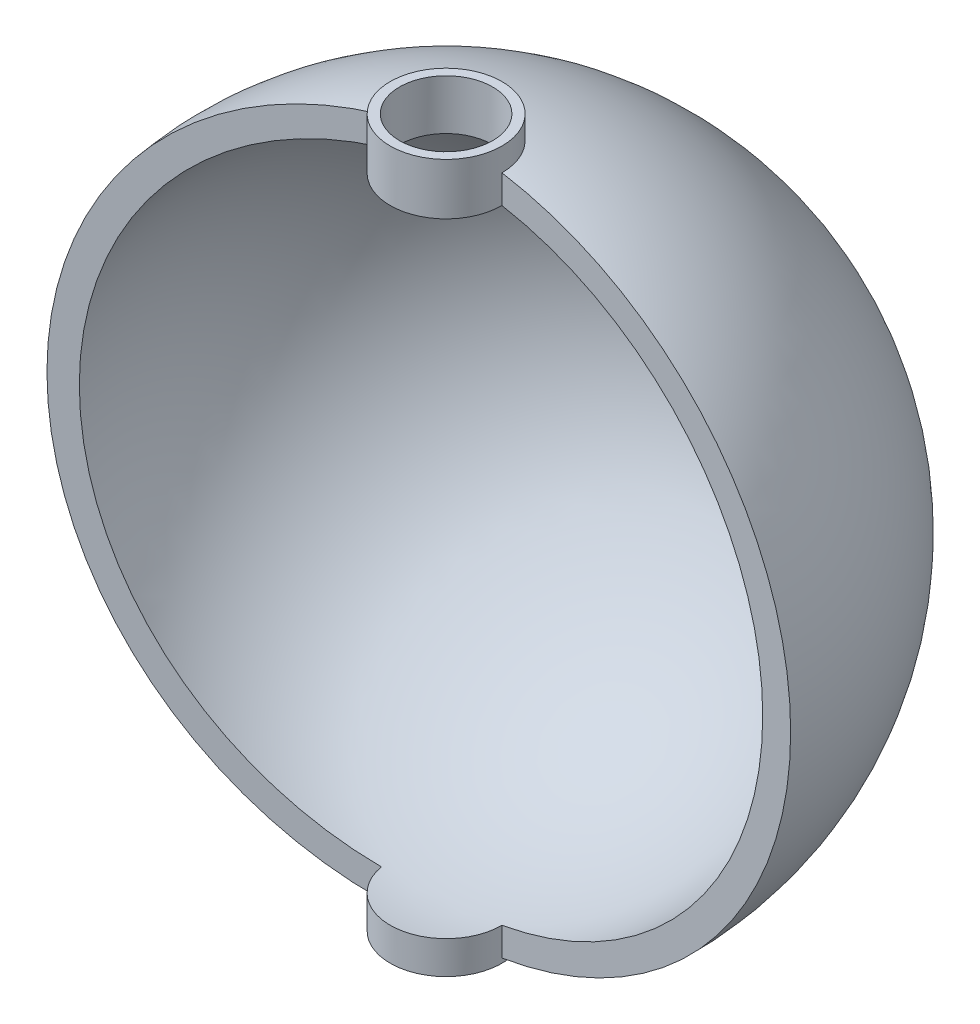
ISO-10303-21;
HEADER;
FILE_DESCRIPTION(('STEP AP214'),'2;1');
FILE_NAME('part.step','',(''),(''),'','','');
FILE_SCHEMA(('AUTOMOTIVE_DESIGN { 1 0 10303 214 1 1 1 1 }'));
ENDSEC;
DATA;
#1=APPLICATION_CONTEXT('core data for automotive mechanical design processes');
#2=APPLICATION_PROTOCOL_DEFINITION('international standard','automotive_design',2000,#1);
#3=PRODUCT_CONTEXT('',#1,'mechanical');
#4=PRODUCT('Part','Part','',(#3));
#5=PRODUCT_RELATED_PRODUCT_CATEGORY('part','',(#4));
#6=PRODUCT_DEFINITION_FORMATION('','',#4);
#7=PRODUCT_DEFINITION_CONTEXT('part definition',#1,'design');
#8=PRODUCT_DEFINITION('design','',#6,#7);
#9=PRODUCT_DEFINITION_SHAPE('','',#8);
#10=(LENGTH_UNIT() NAMED_UNIT(*) SI_UNIT(.MILLI.,.METRE.));
#11=(NAMED_UNIT(*) PLANE_ANGLE_UNIT() SI_UNIT($,.RADIAN.));
#12=(NAMED_UNIT(*) SI_UNIT($,.STERADIAN.) SOLID_ANGLE_UNIT());
#13=UNCERTAINTY_MEASURE_WITH_UNIT(LENGTH_MEASURE(1.E-05),#10,'distance_accuracy_value','');
#14=(GEOMETRIC_REPRESENTATION_CONTEXT(3) GLOBAL_UNCERTAINTY_ASSIGNED_CONTEXT((#13)) GLOBAL_UNIT_ASSIGNED_CONTEXT((#10,
#11,#12)) REPRESENTATION_CONTEXT('',''));
#15=CARTESIAN_POINT('',(0.,0.,0.));
#16=DIRECTION('',(0.,0.,1.));
#17=DIRECTION('',(1.,0.,0.));
#18=AXIS2_PLACEMENT_3D('',#15,#16,#17);
#19=CARTESIAN_POINT('',(0.,0.,0.));
#20=DIRECTION('',(0.,-1.,0.));
#21=DIRECTION('',(0.984807753012207,0.,-0.173648177666937));
#22=AXIS2_PLACEMENT_3D('',#19,#20,#21);
#23=SPHERICAL_SURFACE('',#22,185.);
#24=CARTESIAN_POINT('',(-6.26385393714605E-13,-182.551362635287,0.));
#25=DIRECTION('',(0.,1.,0.));
#26=DIRECTION('',(-1.,0.,0.));
#27=AXIS2_PLACEMENT_3D('',#24,#25,#26);
#28=CIRCLE('',#27,29.9999999999994);
#29=CARTESIAN_POINT('',(-29.5442325903662,-182.551362635287,5.20944533000801));
#30=VERTEX_POINT('',#29);
#31=CARTESIAN_POINT('',(29.9999999999987,-182.551362635287,0.));
#32=VERTEX_POINT('',#31);
#33=EDGE_CURVE('E65',#30,#32,#28,.F.);
#34=ORIENTED_EDGE('',*,*,#33,.F.);
#35=CARTESIAN_POINT('',(0.,0.,0.));
#36=DIRECTION('',(-0.173648177666937,0.,-0.984807753012207));
#37=DIRECTION('',(-0.984807753012207,0.,0.173648177666937));
#38=AXIS2_PLACEMENT_3D('',#35,#36,#37);
#39=CIRCLE('',#38,185.);
#40=CARTESIAN_POINT('',(-29.5442325903662,182.551362635287,5.20944533000812));
#41=VERTEX_POINT('',#40);
#42=EDGE_CURVE('E134',#30,#41,#39,.T.);
#43=ORIENTED_EDGE('',*,*,#42,.T.);
#44=CARTESIAN_POINT('',(0.,182.551362635287,0.));
#45=DIRECTION('',(0.,-1.,0.));
#46=DIRECTION('',(0.,0.,-1.));
#47=AXIS2_PLACEMENT_3D('',#44,#45,#46);
#48=CIRCLE('',#47,30.);
#49=CARTESIAN_POINT('',(30.,182.551362635287,0.));
#50=VERTEX_POINT('',#49);
#51=EDGE_CURVE('E120',#41,#50,#48,.T.);
#52=ORIENTED_EDGE('',*,*,#51,.T.);
#53=CARTESIAN_POINT('',(0.,0.,0.));
#54=DIRECTION('',(0.,0.,1.));
#55=DIRECTION('',(1.,0.,0.));
#56=AXIS2_PLACEMENT_3D('',#53,#54,#55);
#57=CIRCLE('',#56,185.);
#58=EDGE_CURVE('E128',#32,#50,#57,.T.);
#59=ORIENTED_EDGE('',*,*,#58,.F.);
#60=EDGE_LOOP('',(#34,#43,#52,#59));
#61=FACE_BOUND('',#60,.T.);
#62=CARTESIAN_POINT('',(0.,0.,-177.5));
#63=DIRECTION('',(0.,0.,-1.));
#64=DIRECTION('',(-1.,0.,0.));
#65=AXIS2_PLACEMENT_3D('',#62,#63,#64);
#66=CIRCLE('',#65,52.1416340365355);
#67=CARTESIAN_POINT('',(-52.1416340365355,0.,-177.5));
#68=VERTEX_POINT('',#67);
#69=EDGE_CURVE('E44',#68,#68,#66,.F.);
#70=ORIENTED_EDGE('',*,*,#69,.T.);
#71=EDGE_LOOP('',(#70));
#72=FACE_BOUND('',#71,.T.);
#73=ADVANCED_FACE('F41',(#61,#72),#23,.T.);
#74=CARTESIAN_POINT('',(0.,195.,0.));
#75=DIRECTION('',(0.,-1.,0.));
#76=DIRECTION('',(0.,0.,-1.));
#77=AXIS2_PLACEMENT_3D('',#74,#75,#76);
#78=CYLINDRICAL_SURFACE('',#77,30.);
#79=CARTESIAN_POINT('',(0.,195.,0.));
#80=DIRECTION('',(0.,1.,0.));
#81=DIRECTION('',(0.,0.,1.));
#82=AXIS2_PLACEMENT_3D('',#79,#80,#81);
#83=CIRCLE('',#82,30.);
#84=CARTESIAN_POINT('',(0.,195.,30.));
#85=VERTEX_POINT('',#84);
#86=EDGE_CURVE('E116',#85,#85,#83,.T.);
#87=ORIENTED_EDGE('',*,*,#86,.F.);
#88=EDGE_LOOP('',(#87));
#89=FACE_BOUND('',#88,.T.);
#90=CARTESIAN_POINT('',(0.,167.332005306815,0.));
#91=DIRECTION('',(0.,1.,0.));
#92=DIRECTION('',(0.,0.,1.));
#93=AXIS2_PLACEMENT_3D('',#90,#91,#92);
#94=CIRCLE('',#93,30.);
#95=CARTESIAN_POINT('',(-29.5442325903663,167.332005306815,5.20944533000815));
#96=VERTEX_POINT('',#95);
#97=CARTESIAN_POINT('',(30.,167.332005306815,0.));
#98=VERTEX_POINT('',#97);
#99=EDGE_CURVE('E108',#96,#98,#94,.T.);
#100=ORIENTED_EDGE('',*,*,#99,.T.);
#101=DIRECTION('',(0.,-1.,0.));
#102=VECTOR('',#101,1.);
#103=CARTESIAN_POINT('',(30.,195.,0.));
#104=LINE('',#103,#102);
#105=EDGE_CURVE('E140',#50,#98,#104,.T.);
#106=ORIENTED_EDGE('',*,*,#105,.F.);
#107=ORIENTED_EDGE('',*,*,#51,.F.);
#108=DIRECTION('',(0.,-1.,0.));
#109=VECTOR('',#108,1.);
#110=CARTESIAN_POINT('',(-29.5442325903662,195.,5.20944533000812));
#111=LINE('',#110,#109);
#112=EDGE_CURVE('E124',#41,#96,#111,.T.);
#113=ORIENTED_EDGE('',*,*,#112,.T.);
#114=EDGE_LOOP('',(#100,#106,#107,#113));
#115=FACE_BOUND('',#114,.T.);
#116=ADVANCED_FACE('F165',(#89,#115),#78,.T.);
#117=CARTESIAN_POINT('',(0.,-70.7106781186548,0.));
#118=DIRECTION('',(0.,1.,0.));
#119=DIRECTION('',(0.,0.,1.));
#120=AXIS2_PLACEMENT_3D('',#117,#118,#119);
#121=CYLINDRICAL_SURFACE('',#120,25.);
#122=CARTESIAN_POINT('',(0.,195.,0.));
#123=DIRECTION('',(0.,1.,0.));
#124=DIRECTION('',(0.,0.,1.));
#125=AXIS2_PLACEMENT_3D('',#122,#123,#124);
#126=CIRCLE('',#125,25.);
#127=CARTESIAN_POINT('',(0.,195.,25.));
#128=VERTEX_POINT('',#127);
#129=EDGE_CURVE('E112',#128,#128,#126,.T.);
#130=ORIENTED_EDGE('',*,*,#129,.T.);
#131=EDGE_LOOP('',(#130));
#132=FACE_BOUND('',#131,.T.);
#133=CARTESIAN_POINT('',(0.,168.151717208002,0.));
#134=DIRECTION('',(0.,-1.,0.));
#135=DIRECTION('',(0.,0.,-1.));
#136=AXIS2_PLACEMENT_3D('',#133,#134,#135);
#137=CIRCLE('',#136,25.);
#138=CARTESIAN_POINT('',(0.,168.151717208002,-25.));
#139=VERTEX_POINT('',#138);
#140=EDGE_CURVE('E50',#139,#139,#137,.T.);
#141=ORIENTED_EDGE('',*,*,#140,.T.);
#142=EDGE_LOOP('',(#141));
#143=FACE_BOUND('',#142,.T.);
#144=ADVANCED_FACE('F148',(#132,#143),#121,.F.);
#145=CARTESIAN_POINT('',(0.,195.,0.));
#146=DIRECTION('',(0.,1.,0.));
#147=DIRECTION('',(0.,0.,1.));
#148=AXIS2_PLACEMENT_3D('',#145,#146,#147);
#149=PLANE('',#148);
#150=ORIENTED_EDGE('',*,*,#129,.F.);
#151=EDGE_LOOP('',(#150));
#152=FACE_BOUND('',#151,.T.);
#153=ORIENTED_EDGE('',*,*,#86,.T.);
#154=EDGE_LOOP('',(#153));
#155=FACE_BOUND('',#154,.T.);
#156=ADVANCED_FACE('F154',(#152,#155),#149,.T.);
#157=CARTESIAN_POINT('',(0.,0.,0.));
#158=DIRECTION('',(0.,-1.,0.));
#159=DIRECTION('',(0.984807753012207,0.,-0.173648177666937));
#160=AXIS2_PLACEMENT_3D('',#157,#158,#159);
#161=SPHERICAL_SURFACE('',#160,170.);
#162=ORIENTED_EDGE('',*,*,#140,.F.);
#163=EDGE_LOOP('',(#162));
#164=FACE_BOUND('',#163,.T.);
#165=CARTESIAN_POINT('',(0.,0.,0.));
#166=DIRECTION('',(-0.173648177666937,0.,-0.984807753012207));
#167=DIRECTION('',(-0.984807753012207,0.,0.173648177666937));
#168=AXIS2_PLACEMENT_3D('',#165,#166,#167);
#169=CIRCLE('',#168,170.);
#170=CARTESIAN_POINT('',(-29.5442325903662,-167.332005306815,5.20944533000801));
#171=VERTEX_POINT('',#170);
#172=EDGE_CURVE('E137',#171,#96,#169,.T.);
#173=ORIENTED_EDGE('',*,*,#172,.F.);
#174=CARTESIAN_POINT('',(-5.7416347110248E-13,-167.332005306815,0.));
#175=DIRECTION('',(0.,1.,0.));
#176=DIRECTION('',(-1.,0.,0.));
#177=AXIS2_PLACEMENT_3D('',#174,#175,#176);
#178=CIRCLE('',#177,29.9999999999994);
#179=CARTESIAN_POINT('',(29.9999999999988,-167.332005306815,0.));
#180=VERTEX_POINT('',#179);
#181=EDGE_CURVE('E96',#171,#180,#178,.T.);
#182=ORIENTED_EDGE('',*,*,#181,.T.);
#183=CARTESIAN_POINT('',(0.,0.,0.));
#184=DIRECTION('',(0.,0.,1.));
#185=DIRECTION('',(1.,0.,0.));
#186=AXIS2_PLACEMENT_3D('',#183,#184,#185);
#187=CIRCLE('',#186,170.);
#188=EDGE_CURVE('E131',#180,#98,#187,.T.);
#189=ORIENTED_EDGE('',*,*,#188,.T.);
#190=ORIENTED_EDGE('',*,*,#99,.F.);
#191=EDGE_LOOP('',(#173,#182,#189,#190));
#192=FACE_BOUND('',#191,.T.);
#193=ADVANCED_FACE('F150',(#164,#192),#161,.F.);
#194=CARTESIAN_POINT('',(0.,0.,0.));
#195=DIRECTION('',(-0.173648177666937,0.,-0.984807753012207));
#196=DIRECTION('',(-0.984807753012207,0.,0.173648177666937));
#197=AXIS2_PLACEMENT_3D('',#194,#195,#196);
#198=PLANE('',#197);
#199=ORIENTED_EDGE('',*,*,#42,.F.);
#200=DIRECTION('',(0.,1.,0.));
#201=VECTOR('',#200,1.);
#202=CARTESIAN_POINT('',(-29.5442325903656,1.0137462408366E-13,5.20944533000802));
#203=LINE('',#202,#201);
#204=EDGE_CURVE('E57',#30,#171,#203,.T.);
#205=ORIENTED_EDGE('',*,*,#204,.T.);
#206=ORIENTED_EDGE('',*,*,#172,.T.);
#207=ORIENTED_EDGE('',*,*,#112,.F.);
#208=EDGE_LOOP('',(#199,#205,#206,#207));
#209=FACE_BOUND('',#208,.T.);
#210=ADVANCED_FACE('F153',(#209),#198,.F.);
#211=CARTESIAN_POINT('',(0.,0.,0.));
#212=DIRECTION('',(0.,0.,1.));
#213=DIRECTION('',(1.,0.,0.));
#214=AXIS2_PLACEMENT_3D('',#211,#212,#213);
#215=PLANE('',#214);
#216=DIRECTION('',(0.,1.,0.));
#217=VECTOR('',#216,1.);
#218=CARTESIAN_POINT('',(29.9999999999994,-1.02938491064462E-13,0.));
#219=LINE('',#218,#217);
#220=EDGE_CURVE('E11',#32,#180,#219,.T.);
#221=ORIENTED_EDGE('',*,*,#220,.F.);
#222=ORIENTED_EDGE('',*,*,#58,.T.);
#223=ORIENTED_EDGE('',*,*,#105,.T.);
#224=ORIENTED_EDGE('',*,*,#188,.F.);
#225=EDGE_LOOP('',(#221,#222,#223,#224));
#226=FACE_BOUND('',#225,.T.);
#227=ADVANCED_FACE('F160',(#226),#215,.T.);
#228=CARTESIAN_POINT('',(0.,0.,0.));
#229=DIRECTION('',(0.,1.,0.));
#230=DIRECTION('',(-1.,0.,0.));
#231=AXIS2_PLACEMENT_3D('',#228,#229,#230);
#232=CYLINDRICAL_SURFACE('',#231,29.9999999999994);
#233=CARTESIAN_POINT('',(-6.34787361564193E-13,-185.,0.));
#234=DIRECTION('',(0.,1.,0.));
#235=DIRECTION('',(-1.,0.,0.));
#236=AXIS2_PLACEMENT_3D('',#233,#234,#235);
#237=CIRCLE('',#236,29.9999999999993);
#238=CARTESIAN_POINT('',(-30.,-185.,0.));
#239=VERTEX_POINT('',#238);
#240=EDGE_CURVE('E93',#239,#239,#237,.T.);
#241=ORIENTED_EDGE('',*,*,#240,.T.);
#242=EDGE_LOOP('',(#241));
#243=FACE_BOUND('',#242,.T.);
#244=ORIENTED_EDGE('',*,*,#204,.F.);
#245=ORIENTED_EDGE('',*,*,#33,.T.);
#246=ORIENTED_EDGE('',*,*,#220,.T.);
#247=ORIENTED_EDGE('',*,*,#181,.F.);
#248=EDGE_LOOP('',(#244,#245,#246,#247));
#249=FACE_BOUND('',#248,.T.);
#250=ADVANCED_FACE('F89',(#243,#249),#232,.T.);
#251=CARTESIAN_POINT('',(0.,-185.,0.));
#252=DIRECTION('',(0.,-1.,0.));
#253=DIRECTION('',(1.,0.,0.));
#254=AXIS2_PLACEMENT_3D('',#251,#252,#253);
#255=PLANE('',#254);
#256=CARTESIAN_POINT('',(0.,-185.,0.));
#257=VERTEX_POINT('',#256);
#258=VERTEX_LOOP('',#257);
#259=FACE_BOUND('',#258,.T.);
#260=ORIENTED_EDGE('',*,*,#240,.F.);
#261=EDGE_LOOP('',(#260));
#262=FACE_BOUND('',#261,.T.);
#263=ADVANCED_FACE('F85',(#259,#262),#255,.T.);
#264=CARTESIAN_POINT('',(0.,-185.,-177.5));
#265=DIRECTION('',(0.,0.,-1.));
#266=DIRECTION('',(-1.,0.,0.));
#267=AXIS2_PLACEMENT_3D('',#264,#265,#266);
#268=PLANE('',#267);
#269=ORIENTED_EDGE('',*,*,#69,.F.);
#270=EDGE_LOOP('',(#269));
#271=FACE_BOUND('',#270,.T.);
#272=ADVANCED_FACE('F88',(#271),#268,.T.);
#273=CLOSED_SHELL('',(#73,#116,#144,#156,#193,#210,#227,#250,#263,#272));
#274=MANIFOLD_SOLID_BREP('B2',#273);
#275=ADVANCED_BREP_SHAPE_REPRESENTATION('',(#18,#274),#14);
#276=SHAPE_DEFINITION_REPRESENTATION(#9,#275);
ENDSEC;
END-ISO-10303-21;
